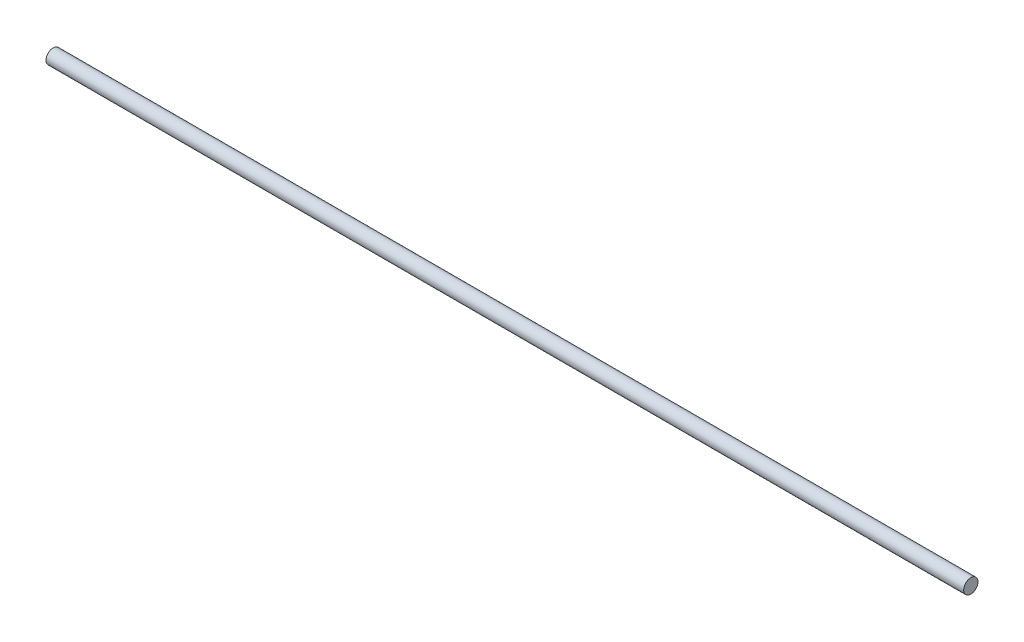
ISO-10303-21;
HEADER;
FILE_DESCRIPTION(('STEP AP214'),'2;1');
FILE_NAME('part.step','',(''),(''),'','','');
FILE_SCHEMA(('AUTOMOTIVE_DESIGN { 1 0 10303 214 1 1 1 1 }'));
ENDSEC;
DATA;
#1=APPLICATION_CONTEXT('core data for automotive mechanical design processes');
#2=APPLICATION_PROTOCOL_DEFINITION('international standard','automotive_design',2000,#1);
#3=PRODUCT_CONTEXT('',#1,'mechanical');
#4=PRODUCT('Part','Part','',(#3));
#5=PRODUCT_RELATED_PRODUCT_CATEGORY('part','',(#4));
#6=PRODUCT_DEFINITION_FORMATION('','',#4);
#7=PRODUCT_DEFINITION_CONTEXT('part definition',#1,'design');
#8=PRODUCT_DEFINITION('design','',#6,#7);
#9=PRODUCT_DEFINITION_SHAPE('','',#8);
#10=(LENGTH_UNIT() NAMED_UNIT(*) SI_UNIT(.MILLI.,.METRE.));
#11=(NAMED_UNIT(*) PLANE_ANGLE_UNIT() SI_UNIT($,.RADIAN.));
#12=(NAMED_UNIT(*) SI_UNIT($,.STERADIAN.) SOLID_ANGLE_UNIT());
#13=UNCERTAINTY_MEASURE_WITH_UNIT(LENGTH_MEASURE(1.E-05),#10,'distance_accuracy_value','');
#14=(GEOMETRIC_REPRESENTATION_CONTEXT(3) GLOBAL_UNCERTAINTY_ASSIGNED_CONTEXT((#13)) GLOBAL_UNIT_ASSIGNED_CONTEXT((#10,
#11,#12)) REPRESENTATION_CONTEXT('',''));
#15=CARTESIAN_POINT('',(0.,0.,0.));
#16=DIRECTION('',(0.,0.,1.));
#17=DIRECTION('',(1.,0.,0.));
#18=AXIS2_PLACEMENT_3D('',#15,#16,#17);
#19=CARTESIAN_POINT('',(127.,0.,0.));
#20=DIRECTION('',(-1.,0.,0.));
#21=DIRECTION('',(0.,0.,1.));
#22=AXIS2_PLACEMENT_3D('',#19,#20,#21);
#23=CYLINDRICAL_SURFACE('',#22,1.984375);
#24=CARTESIAN_POINT('',(127.,0.,0.));
#25=DIRECTION('',(1.,0.,0.));
#26=DIRECTION('',(0.,0.,-1.));
#27=AXIS2_PLACEMENT_3D('',#24,#25,#26);
#28=CIRCLE('',#27,1.984375);
#29=CARTESIAN_POINT('',(127.,0.,-1.984375));
#30=VERTEX_POINT('',#29);
#31=EDGE_CURVE('E10',#30,#30,#28,.T.);
#32=ORIENTED_EDGE('',*,*,#31,.F.);
#33=EDGE_LOOP('',(#32));
#34=FACE_BOUND('',#33,.T.);
#35=CARTESIAN_POINT('',(-127.,0.,0.));
#36=DIRECTION('',(1.,0.,0.));
#37=DIRECTION('',(0.,0.,-1.));
#38=AXIS2_PLACEMENT_3D('',#35,#36,#37);
#39=CIRCLE('',#38,1.984375);
#40=CARTESIAN_POINT('',(-127.,0.,-1.984375));
#41=VERTEX_POINT('',#40);
#42=EDGE_CURVE('E40',#41,#41,#39,.T.);
#43=ORIENTED_EDGE('',*,*,#42,.T.);
#44=EDGE_LOOP('',(#43));
#45=FACE_BOUND('',#44,.T.);
#46=ADVANCED_FACE('F37',(#34,#45),#23,.T.);
#47=CARTESIAN_POINT('',(127.,0.,0.));
#48=DIRECTION('',(1.,0.,0.));
#49=DIRECTION('',(0.,0.,-1.));
#50=AXIS2_PLACEMENT_3D('',#47,#48,#49);
#51=PLANE('',#50);
#52=ORIENTED_EDGE('',*,*,#31,.T.);
#53=EDGE_LOOP('',(#52));
#54=FACE_BOUND('',#53,.T.);
#55=ADVANCED_FACE('F52',(#54),#51,.T.);
#56=CARTESIAN_POINT('',(-127.,0.,0.));
#57=DIRECTION('',(1.,0.,0.));
#58=DIRECTION('',(0.,0.,-1.));
#59=AXIS2_PLACEMENT_3D('',#56,#57,#58);
#60=PLANE('',#59);
#61=ORIENTED_EDGE('',*,*,#42,.F.);
#62=EDGE_LOOP('',(#61));
#63=FACE_BOUND('',#62,.T.);
#64=ADVANCED_FACE('F50',(#63),#60,.F.);
#65=CLOSED_SHELL('',(#46,#55,#64));
#66=MANIFOLD_SOLID_BREP('B2',#65);
#67=ADVANCED_BREP_SHAPE_REPRESENTATION('',(#18,#66),#14);
#68=SHAPE_DEFINITION_REPRESENTATION(#9,#67);
ENDSEC;
END-ISO-10303-21;
